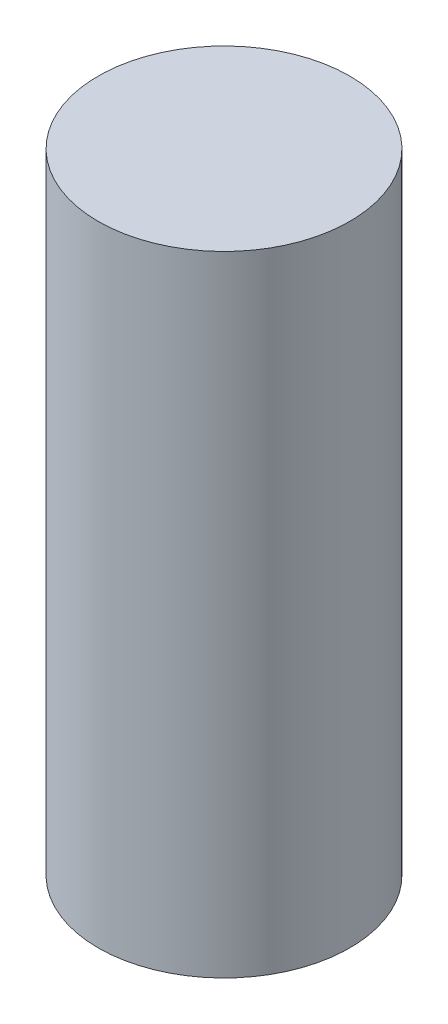
ISO-10303-21;
HEADER;
FILE_DESCRIPTION(('STEP AP214'),'2;1');
FILE_NAME('part.step','',(''),(''),'','','');
FILE_SCHEMA(('AUTOMOTIVE_DESIGN { 1 0 10303 214 1 1 1 1 }'));
ENDSEC;
DATA;
#1=APPLICATION_CONTEXT('core data for automotive mechanical design processes');
#2=APPLICATION_PROTOCOL_DEFINITION('international standard','automotive_design',2000,#1);
#3=PRODUCT_CONTEXT('',#1,'mechanical');
#4=PRODUCT('Part','Part','',(#3));
#5=PRODUCT_RELATED_PRODUCT_CATEGORY('part','',(#4));
#6=PRODUCT_DEFINITION_FORMATION('','',#4);
#7=PRODUCT_DEFINITION_CONTEXT('part definition',#1,'design');
#8=PRODUCT_DEFINITION('design','',#6,#7);
#9=PRODUCT_DEFINITION_SHAPE('','',#8);
#10=(LENGTH_UNIT() NAMED_UNIT(*) SI_UNIT(.MILLI.,.METRE.));
#11=(NAMED_UNIT(*) PLANE_ANGLE_UNIT() SI_UNIT($,.RADIAN.));
#12=(NAMED_UNIT(*) SI_UNIT($,.STERADIAN.) SOLID_ANGLE_UNIT());
#13=UNCERTAINTY_MEASURE_WITH_UNIT(LENGTH_MEASURE(1.E-05),#10,'distance_accuracy_value','');
#14=(GEOMETRIC_REPRESENTATION_CONTEXT(3) GLOBAL_UNCERTAINTY_ASSIGNED_CONTEXT((#13)) GLOBAL_UNIT_ASSIGNED_CONTEXT((#10,
#11,#12)) REPRESENTATION_CONTEXT('',''));
#15=CARTESIAN_POINT('',(0.,0.,0.));
#16=DIRECTION('',(0.,0.,1.));
#17=DIRECTION('',(1.,0.,0.));
#18=AXIS2_PLACEMENT_3D('',#15,#16,#17);
#19=CARTESIAN_POINT('',(0.,3048.,0.));
#20=DIRECTION('',(0.,-1.,0.));
#21=DIRECTION('',(0.,0.,-1.));
#22=AXIS2_PLACEMENT_3D('',#19,#20,#21);
#23=CYLINDRICAL_SURFACE('',#22,609.6);
#24=CARTESIAN_POINT('',(0.,3048.,0.));
#25=DIRECTION('',(0.,1.,0.));
#26=DIRECTION('',(0.,0.,1.));
#27=AXIS2_PLACEMENT_3D('',#24,#25,#26);
#28=CIRCLE('',#27,609.6);
#29=CARTESIAN_POINT('',(0.,3048.,609.6));
#30=VERTEX_POINT('',#29);
#31=EDGE_CURVE('E10',#30,#30,#28,.T.);
#32=ORIENTED_EDGE('',*,*,#31,.F.);
#33=EDGE_LOOP('',(#32));
#34=FACE_BOUND('',#33,.T.);
#35=CARTESIAN_POINT('',(0.,0.,0.));
#36=DIRECTION('',(0.,1.,0.));
#37=DIRECTION('',(0.,0.,1.));
#38=AXIS2_PLACEMENT_3D('',#35,#36,#37);
#39=CIRCLE('',#38,609.6);
#40=CARTESIAN_POINT('',(0.,0.,609.6));
#41=VERTEX_POINT('',#40);
#42=EDGE_CURVE('E34',#41,#41,#39,.T.);
#43=ORIENTED_EDGE('',*,*,#42,.T.);
#44=EDGE_LOOP('',(#43));
#45=FACE_BOUND('',#44,.T.);
#46=ADVANCED_FACE('F31',(#34,#45),#23,.T.);
#47=CARTESIAN_POINT('',(0.,3048.,0.));
#48=DIRECTION('',(0.,1.,0.));
#49=DIRECTION('',(0.,0.,1.));
#50=AXIS2_PLACEMENT_3D('',#47,#48,#49);
#51=PLANE('',#50);
#52=ORIENTED_EDGE('',*,*,#31,.T.);
#53=EDGE_LOOP('',(#52));
#54=FACE_BOUND('',#53,.T.);
#55=ADVANCED_FACE('F46',(#54),#51,.T.);
#56=CARTESIAN_POINT('',(0.,0.,0.));
#57=DIRECTION('',(0.,1.,0.));
#58=DIRECTION('',(0.,0.,1.));
#59=AXIS2_PLACEMENT_3D('',#56,#57,#58);
#60=PLANE('',#59);
#61=ORIENTED_EDGE('',*,*,#42,.F.);
#62=EDGE_LOOP('',(#61));
#63=FACE_BOUND('',#62,.T.);
#64=ADVANCED_FACE('F44',(#63),#60,.F.);
#65=CLOSED_SHELL('',(#46,#55,#64));
#66=MANIFOLD_SOLID_BREP('B2',#65);
#67=ADVANCED_BREP_SHAPE_REPRESENTATION('',(#18,#66),#14);
#68=SHAPE_DEFINITION_REPRESENTATION(#9,#67);
ENDSEC;
END-ISO-10303-21;
